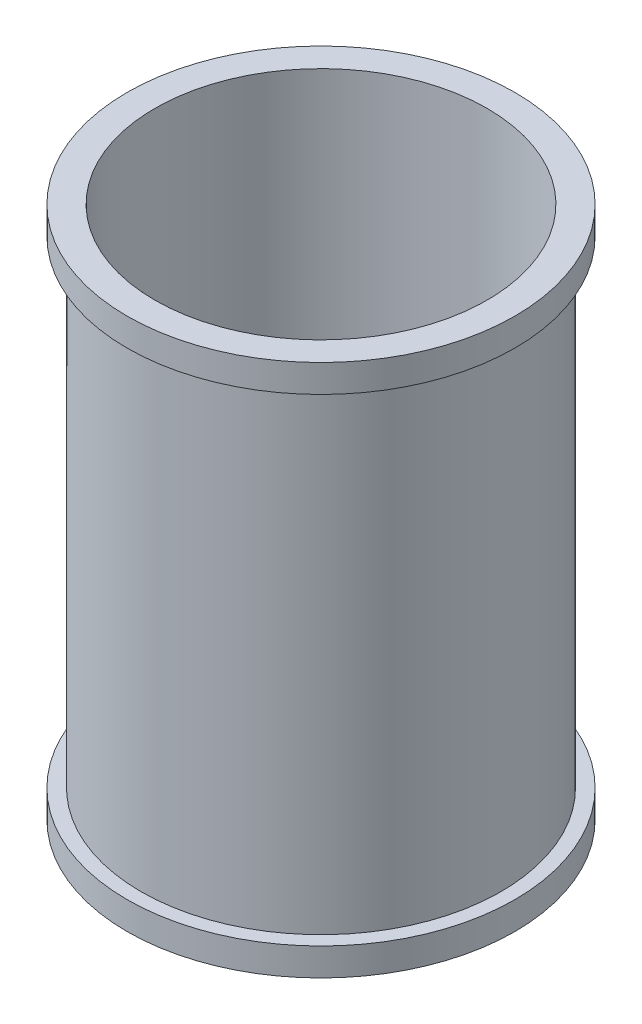
ISO-10303-21;
HEADER;
FILE_DESCRIPTION(('STEP AP214'),'2;1');
FILE_NAME('part.step','',(''),(''),'','','');
FILE_SCHEMA(('AUTOMOTIVE_DESIGN { 1 0 10303 214 1 1 1 1 }'));
ENDSEC;
DATA;
#1=APPLICATION_CONTEXT('core data for automotive mechanical design processes');
#2=APPLICATION_PROTOCOL_DEFINITION('international standard','automotive_design',2000,#1);
#3=PRODUCT_CONTEXT('',#1,'mechanical');
#4=PRODUCT('Part','Part','',(#3));
#5=PRODUCT_RELATED_PRODUCT_CATEGORY('part','',(#4));
#6=PRODUCT_DEFINITION_FORMATION('','',#4);
#7=PRODUCT_DEFINITION_CONTEXT('part definition',#1,'design');
#8=PRODUCT_DEFINITION('design','',#6,#7);
#9=PRODUCT_DEFINITION_SHAPE('','',#8);
#10=(LENGTH_UNIT() NAMED_UNIT(*) SI_UNIT(.MILLI.,.METRE.));
#11=(NAMED_UNIT(*) PLANE_ANGLE_UNIT() SI_UNIT($,.RADIAN.));
#12=(NAMED_UNIT(*) SI_UNIT($,.STERADIAN.) SOLID_ANGLE_UNIT());
#13=UNCERTAINTY_MEASURE_WITH_UNIT(LENGTH_MEASURE(1.E-05),#10,'distance_accuracy_value','');
#14=(GEOMETRIC_REPRESENTATION_CONTEXT(3) GLOBAL_UNCERTAINTY_ASSIGNED_CONTEXT((#13)) GLOBAL_UNIT_ASSIGNED_CONTEXT((#10,
#11,#12)) REPRESENTATION_CONTEXT('',''));
#15=CARTESIAN_POINT('',(0.,0.,0.));
#16=DIRECTION('',(0.,0.,1.));
#17=DIRECTION('',(1.,0.,0.));
#18=AXIS2_PLACEMENT_3D('',#15,#16,#17);
#19=CARTESIAN_POINT('',(0.,12.7,0.));
#20=DIRECTION('',(0.,1.,0.));
#21=DIRECTION('',(0.,0.,1.));
#22=AXIS2_PLACEMENT_3D('',#19,#20,#21);
#23=PLANE('',#22);
#24=CARTESIAN_POINT('',(0.,12.7,0.));
#25=DIRECTION('',(0.,1.,0.));
#26=DIRECTION('',(0.,0.,1.));
#27=AXIS2_PLACEMENT_3D('',#24,#25,#26);
#28=CIRCLE('',#27,88.9);
#29=CARTESIAN_POINT('',(0.,12.7,88.9));
#30=VERTEX_POINT('',#29);
#31=EDGE_CURVE('E10',#30,#30,#28,.T.);
#32=ORIENTED_EDGE('',*,*,#31,.T.);
#33=EDGE_LOOP('',(#32));
#34=FACE_BOUND('',#33,.T.);
#35=CARTESIAN_POINT('',(0.,12.7,0.));
#36=DIRECTION('',(0.,1.,0.));
#37=DIRECTION('',(0.,0.,1.));
#38=AXIS2_PLACEMENT_3D('',#35,#36,#37);
#39=CIRCLE('',#38,82.55);
#40=CARTESIAN_POINT('',(0.,12.7,82.55));
#41=VERTEX_POINT('',#40);
#42=EDGE_CURVE('E49',#41,#41,#39,.T.);
#43=ORIENTED_EDGE('',*,*,#42,.F.);
#44=EDGE_LOOP('',(#43));
#45=FACE_BOUND('',#44,.T.);
#46=ADVANCED_FACE('F33',(#34,#45),#23,.T.);
#47=CARTESIAN_POINT('',(0.,0.,0.));
#48=DIRECTION('',(0.,1.,0.));
#49=DIRECTION('',(0.,0.,1.));
#50=AXIS2_PLACEMENT_3D('',#47,#48,#49);
#51=PLANE('',#50);
#52=CARTESIAN_POINT('',(0.,0.,0.));
#53=DIRECTION('',(0.,1.,0.));
#54=DIRECTION('',(0.,0.,1.));
#55=AXIS2_PLACEMENT_3D('',#52,#53,#54);
#56=CIRCLE('',#55,88.9);
#57=CARTESIAN_POINT('',(0.,0.,88.9));
#58=VERTEX_POINT('',#57);
#59=EDGE_CURVE('E37',#58,#58,#56,.T.);
#60=ORIENTED_EDGE('',*,*,#59,.F.);
#61=EDGE_LOOP('',(#60));
#62=FACE_BOUND('',#61,.T.);
#63=CARTESIAN_POINT('',(0.,0.,0.));
#64=DIRECTION('',(0.,1.,0.));
#65=DIRECTION('',(0.,0.,1.));
#66=AXIS2_PLACEMENT_3D('',#63,#64,#65);
#67=CIRCLE('',#66,76.2);
#68=CARTESIAN_POINT('',(0.,0.,76.2));
#69=VERTEX_POINT('',#68);
#70=EDGE_CURVE('E44',#69,#69,#67,.T.);
#71=ORIENTED_EDGE('',*,*,#70,.T.);
#72=EDGE_LOOP('',(#71));
#73=FACE_BOUND('',#72,.T.);
#74=ADVANCED_FACE('F82',(#62,#73),#51,.F.);
#75=CARTESIAN_POINT('',(0.,12.7,0.));
#76=DIRECTION('',(0.,-1.,0.));
#77=DIRECTION('',(0.,0.,-1.));
#78=AXIS2_PLACEMENT_3D('',#75,#76,#77);
#79=CYLINDRICAL_SURFACE('',#78,88.9);
#80=ORIENTED_EDGE('',*,*,#31,.F.);
#81=EDGE_LOOP('',(#80));
#82=FACE_BOUND('',#81,.T.);
#83=ORIENTED_EDGE('',*,*,#59,.T.);
#84=EDGE_LOOP('',(#83));
#85=FACE_BOUND('',#84,.T.);
#86=ADVANCED_FACE('F35',(#82,#85),#79,.T.);
#87=CARTESIAN_POINT('',(0.,12.7,0.));
#88=DIRECTION('',(0.,-1.,0.));
#89=DIRECTION('',(0.,0.,-1.));
#90=AXIS2_PLACEMENT_3D('',#87,#88,#89);
#91=CYLINDRICAL_SURFACE('',#90,76.2);
#92=ORIENTED_EDGE('',*,*,#70,.F.);
#93=EDGE_LOOP('',(#92));
#94=FACE_BOUND('',#93,.T.);
#95=CARTESIAN_POINT('',(0.,244.475,0.));
#96=DIRECTION('',(0.,1.,0.));
#97=DIRECTION('',(0.,0.,1.));
#98=AXIS2_PLACEMENT_3D('',#95,#96,#97);
#99=CIRCLE('',#98,76.2);
#100=CARTESIAN_POINT('',(0.,244.475,76.2));
#101=VERTEX_POINT('',#100);
#102=EDGE_CURVE('E58',#101,#101,#99,.T.);
#103=ORIENTED_EDGE('',*,*,#102,.T.);
#104=EDGE_LOOP('',(#103));
#105=FACE_BOUND('',#104,.T.);
#106=ADVANCED_FACE('F64',(#94,#105),#91,.F.);
#107=CARTESIAN_POINT('',(0.,231.775,0.));
#108=DIRECTION('',(0.,-1.,0.));
#109=DIRECTION('',(0.,0.,-1.));
#110=AXIS2_PLACEMENT_3D('',#107,#108,#109);
#111=CYLINDRICAL_SURFACE('',#110,82.55);
#112=CARTESIAN_POINT('',(0.,231.775,0.));
#113=DIRECTION('',(0.,1.,0.));
#114=DIRECTION('',(0.,0.,1.));
#115=AXIS2_PLACEMENT_3D('',#112,#113,#114);
#116=CIRCLE('',#115,82.55);
#117=CARTESIAN_POINT('',(0.,231.775,82.55));
#118=VERTEX_POINT('',#117);
#119=EDGE_CURVE('E48',#118,#118,#116,.T.);
#120=ORIENTED_EDGE('',*,*,#119,.F.);
#121=EDGE_LOOP('',(#120));
#122=FACE_BOUND('',#121,.T.);
#123=ORIENTED_EDGE('',*,*,#42,.T.);
#124=EDGE_LOOP('',(#123));
#125=FACE_BOUND('',#124,.T.);
#126=ADVANCED_FACE('F78',(#122,#125),#111,.T.);
#127=CARTESIAN_POINT('',(0.,231.775,0.));
#128=DIRECTION('',(0.,1.,0.));
#129=DIRECTION('',(0.,0.,1.));
#130=AXIS2_PLACEMENT_3D('',#127,#128,#129);
#131=PLANE('',#130);
#132=CARTESIAN_POINT('',(0.,231.775,0.));
#133=DIRECTION('',(0.,1.,0.));
#134=DIRECTION('',(0.,0.,1.));
#135=AXIS2_PLACEMENT_3D('',#132,#133,#134);
#136=CIRCLE('',#135,88.9);
#137=CARTESIAN_POINT('',(0.,231.775,88.9));
#138=VERTEX_POINT('',#137);
#139=EDGE_CURVE('E55',#138,#138,#136,.T.);
#140=ORIENTED_EDGE('',*,*,#139,.F.);
#141=EDGE_LOOP('',(#140));
#142=FACE_BOUND('',#141,.T.);
#143=ORIENTED_EDGE('',*,*,#119,.T.);
#144=EDGE_LOOP('',(#143));
#145=FACE_BOUND('',#144,.T.);
#146=ADVANCED_FACE('F69',(#142,#145),#131,.F.);
#147=CARTESIAN_POINT('',(0.,244.475,0.));
#148=DIRECTION('',(0.,1.,0.));
#149=DIRECTION('',(0.,0.,1.));
#150=AXIS2_PLACEMENT_3D('',#147,#148,#149);
#151=PLANE('',#150);
#152=CARTESIAN_POINT('',(0.,244.475,0.));
#153=DIRECTION('',(0.,1.,0.));
#154=DIRECTION('',(0.,0.,1.));
#155=AXIS2_PLACEMENT_3D('',#152,#153,#154);
#156=CIRCLE('',#155,88.9);
#157=CARTESIAN_POINT('',(0.,244.475,88.9));
#158=VERTEX_POINT('',#157);
#159=EDGE_CURVE('E52',#158,#158,#156,.T.);
#160=ORIENTED_EDGE('',*,*,#159,.T.);
#161=EDGE_LOOP('',(#160));
#162=FACE_BOUND('',#161,.T.);
#163=ORIENTED_EDGE('',*,*,#102,.F.);
#164=EDGE_LOOP('',(#163));
#165=FACE_BOUND('',#164,.T.);
#166=ADVANCED_FACE('F66',(#162,#165),#151,.T.);
#167=CARTESIAN_POINT('',(0.,244.475,0.));
#168=DIRECTION('',(0.,-1.,0.));
#169=DIRECTION('',(0.,0.,-1.));
#170=AXIS2_PLACEMENT_3D('',#167,#168,#169);
#171=CYLINDRICAL_SURFACE('',#170,88.9);
#172=ORIENTED_EDGE('',*,*,#159,.F.);
#173=EDGE_LOOP('',(#172));
#174=FACE_BOUND('',#173,.T.);
#175=ORIENTED_EDGE('',*,*,#139,.T.);
#176=EDGE_LOOP('',(#175));
#177=FACE_BOUND('',#176,.T.);
#178=ADVANCED_FACE('F68',(#174,#177),#171,.T.);
#179=CLOSED_SHELL('',(#46,#74,#86,#106,#126,#146,#166,#178));
#180=MANIFOLD_SOLID_BREP('B2',#179);
#181=ADVANCED_BREP_SHAPE_REPRESENTATION('',(#18,#180),#14);
#182=SHAPE_DEFINITION_REPRESENTATION(#9,#181);
ENDSEC;
END-ISO-10303-21;
